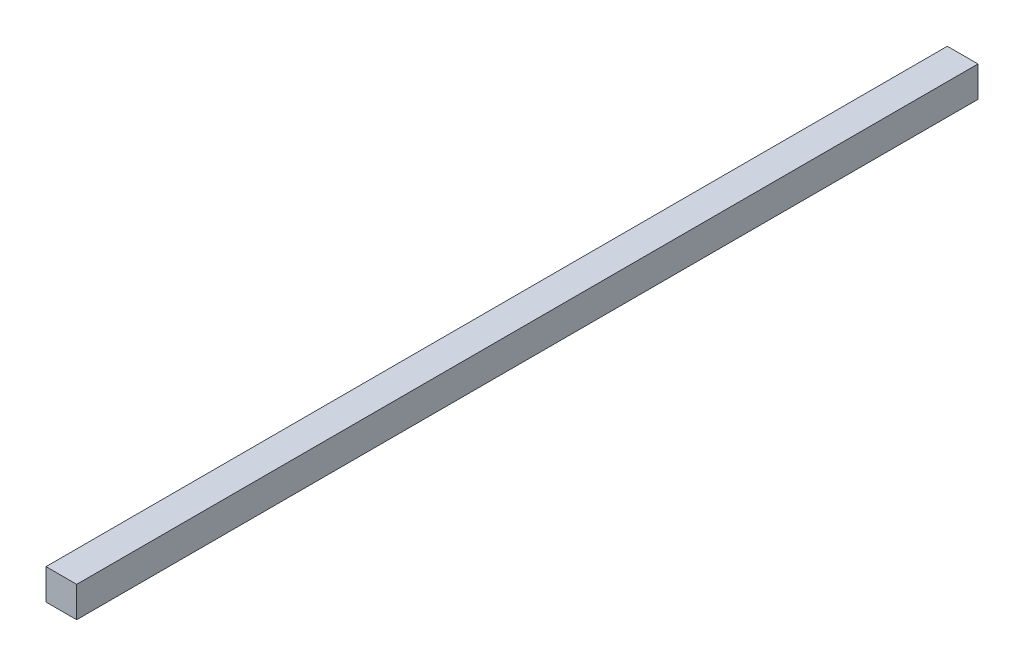
ISO-10303-21;
HEADER;
FILE_DESCRIPTION(('STEP AP214'),'2;1');
FILE_NAME('part.step','',(''),(''),'','','');
FILE_SCHEMA(('AUTOMOTIVE_DESIGN { 1 0 10303 214 1 1 1 1 }'));
ENDSEC;
DATA;
#1=APPLICATION_CONTEXT('core data for automotive mechanical design processes');
#2=APPLICATION_PROTOCOL_DEFINITION('international standard','automotive_design',2000,#1);
#3=PRODUCT_CONTEXT('',#1,'mechanical');
#4=PRODUCT('Part','Part','',(#3));
#5=PRODUCT_RELATED_PRODUCT_CATEGORY('part','',(#4));
#6=PRODUCT_DEFINITION_FORMATION('','',#4);
#7=PRODUCT_DEFINITION_CONTEXT('part definition',#1,'design');
#8=PRODUCT_DEFINITION('design','',#6,#7);
#9=PRODUCT_DEFINITION_SHAPE('','',#8);
#10=(LENGTH_UNIT() NAMED_UNIT(*) SI_UNIT(.MILLI.,.METRE.));
#11=(NAMED_UNIT(*) PLANE_ANGLE_UNIT() SI_UNIT($,.RADIAN.));
#12=(NAMED_UNIT(*) SI_UNIT($,.STERADIAN.) SOLID_ANGLE_UNIT());
#13=UNCERTAINTY_MEASURE_WITH_UNIT(LENGTH_MEASURE(1.E-05),#10,'distance_accuracy_value','');
#14=(GEOMETRIC_REPRESENTATION_CONTEXT(3) GLOBAL_UNCERTAINTY_ASSIGNED_CONTEXT((#13)) GLOBAL_UNIT_ASSIGNED_CONTEXT((#10,
#11,#12)) REPRESENTATION_CONTEXT('',''));
#15=CARTESIAN_POINT('',(0.,0.,0.));
#16=DIRECTION('',(0.,0.,1.));
#17=DIRECTION('',(1.,0.,0.));
#18=AXIS2_PLACEMENT_3D('',#15,#16,#17);
#19=CARTESIAN_POINT('',(1.41224,1.41224,0.));
#20=DIRECTION('',(0.,0.,-1.));
#21=DIRECTION('',(-1.,0.,0.));
#22=AXIS2_PLACEMENT_3D('',#19,#20,#21);
#23=PLANE('',#22);
#24=DIRECTION('',(0.,-1.,0.));
#25=VECTOR('',#24,1.);
#26=CARTESIAN_POINT('',(0.,1.41224,0.));
#27=LINE('',#26,#25);
#28=CARTESIAN_POINT('',(0.,1.41224,0.));
#29=VERTEX_POINT('',#28);
#30=CARTESIAN_POINT('',(0.,0.,0.));
#31=VERTEX_POINT('',#30);
#32=EDGE_CURVE('E96',#29,#31,#27,.T.);
#33=ORIENTED_EDGE('',*,*,#32,.T.);
#34=DIRECTION('',(-1.,0.,0.));
#35=VECTOR('',#34,1.);
#36=CARTESIAN_POINT('',(1.41224,0.,0.));
#37=LINE('',#36,#35);
#38=CARTESIAN_POINT('',(1.41224,0.,0.));
#39=VERTEX_POINT('',#38);
#40=EDGE_CURVE('E11',#39,#31,#37,.T.);
#41=ORIENTED_EDGE('',*,*,#40,.F.);
#42=DIRECTION('',(0.,-1.,0.));
#43=VECTOR('',#42,1.);
#44=CARTESIAN_POINT('',(1.41224,1.41224,0.));
#45=LINE('',#44,#43);
#46=CARTESIAN_POINT('',(1.41224,1.41224,0.));
#47=VERTEX_POINT('',#46);
#48=EDGE_CURVE('E84',#47,#39,#45,.T.);
#49=ORIENTED_EDGE('',*,*,#48,.F.);
#50=DIRECTION('',(-1.,0.,0.));
#51=VECTOR('',#50,1.);
#52=CARTESIAN_POINT('',(1.41224,1.41224,0.));
#53=LINE('',#52,#51);
#54=EDGE_CURVE('E92',#47,#29,#53,.T.);
#55=ORIENTED_EDGE('',*,*,#54,.T.);
#56=EDGE_LOOP('',(#33,#41,#49,#55));
#57=FACE_BOUND('',#56,.T.);
#58=ADVANCED_FACE('F33',(#57),#23,.F.);
#59=CARTESIAN_POINT('',(1.41224,0.,0.));
#60=DIRECTION('',(0.,1.,0.));
#61=DIRECTION('',(0.,0.,1.));
#62=AXIS2_PLACEMENT_3D('',#59,#60,#61);
#63=PLANE('',#62);
#64=DIRECTION('',(0.,0.,-1.));
#65=VECTOR('',#64,1.);
#66=CARTESIAN_POINT('',(0.,0.,0.));
#67=LINE('',#66,#65);
#68=CARTESIAN_POINT('',(0.,0.,-41.4909));
#69=VERTEX_POINT('',#68);
#70=EDGE_CURVE('E88',#31,#69,#67,.T.);
#71=ORIENTED_EDGE('',*,*,#70,.T.);
#72=DIRECTION('',(-1.,0.,0.));
#73=VECTOR('',#72,1.);
#74=CARTESIAN_POINT('',(1.41224,0.,-41.4909));
#75=LINE('',#74,#73);
#76=CARTESIAN_POINT('',(1.41224,0.,-41.4909));
#77=VERTEX_POINT('',#76);
#78=EDGE_CURVE('E41',#77,#69,#75,.T.);
#79=ORIENTED_EDGE('',*,*,#78,.F.);
#80=DIRECTION('',(0.,0.,-1.));
#81=VECTOR('',#80,1.);
#82=CARTESIAN_POINT('',(1.41224,0.,0.));
#83=LINE('',#82,#81);
#84=EDGE_CURVE('E79',#39,#77,#83,.T.);
#85=ORIENTED_EDGE('',*,*,#84,.F.);
#86=ORIENTED_EDGE('',*,*,#40,.T.);
#87=EDGE_LOOP('',(#71,#79,#85,#86));
#88=FACE_BOUND('',#87,.T.);
#89=ADVANCED_FACE('F87',(#88),#63,.F.);
#90=CARTESIAN_POINT('',(1.41224,0.,-41.4909));
#91=DIRECTION('',(0.,0.,1.));
#92=DIRECTION('',(1.,0.,0.));
#93=AXIS2_PLACEMENT_3D('',#90,#91,#92);
#94=PLANE('',#93);
#95=DIRECTION('',(0.,1.,0.));
#96=VECTOR('',#95,1.);
#97=CARTESIAN_POINT('',(0.,0.,-41.4909));
#98=LINE('',#97,#96);
#99=CARTESIAN_POINT('',(0.,1.41224000000001,-41.4909));
#100=VERTEX_POINT('',#99);
#101=EDGE_CURVE('E66',#69,#100,#98,.T.);
#102=ORIENTED_EDGE('',*,*,#101,.T.);
#103=DIRECTION('',(-1.,0.,0.));
#104=VECTOR('',#103,1.);
#105=CARTESIAN_POINT('',(1.41224,1.41224000000001,-41.4909));
#106=LINE('',#105,#104);
#107=CARTESIAN_POINT('',(1.41224,1.41224000000001,-41.4909));
#108=VERTEX_POINT('',#107);
#109=EDGE_CURVE('E89',#108,#100,#106,.T.);
#110=ORIENTED_EDGE('',*,*,#109,.F.);
#111=DIRECTION('',(0.,1.,0.));
#112=VECTOR('',#111,1.);
#113=CARTESIAN_POINT('',(1.41224,0.,-41.4909));
#114=LINE('',#113,#112);
#115=EDGE_CURVE('E82',#77,#108,#114,.T.);
#116=ORIENTED_EDGE('',*,*,#115,.F.);
#117=ORIENTED_EDGE('',*,*,#78,.T.);
#118=EDGE_LOOP('',(#102,#110,#116,#117));
#119=FACE_BOUND('',#118,.T.);
#120=ADVANCED_FACE('F90',(#119),#94,.F.);
#121=CARTESIAN_POINT('',(1.41224,1.41224000000001,-41.4909));
#122=DIRECTION('',(0.,-1.,0.));
#123=DIRECTION('',(0.,0.,-1.));
#124=AXIS2_PLACEMENT_3D('',#121,#122,#123);
#125=PLANE('',#124);
#126=DIRECTION('',(0.,0.,1.));
#127=VECTOR('',#126,1.);
#128=CARTESIAN_POINT('',(0.,1.41224000000001,-41.4909));
#129=LINE('',#128,#127);
#130=EDGE_CURVE('E72',#100,#29,#129,.T.);
#131=ORIENTED_EDGE('',*,*,#130,.T.);
#132=ORIENTED_EDGE('',*,*,#54,.F.);
#133=DIRECTION('',(0.,0.,1.));
#134=VECTOR('',#133,1.);
#135=CARTESIAN_POINT('',(1.41224,1.41224000000001,-41.4909));
#136=LINE('',#135,#134);
#137=EDGE_CURVE('E49',#108,#47,#136,.T.);
#138=ORIENTED_EDGE('',*,*,#137,.F.);
#139=ORIENTED_EDGE('',*,*,#109,.T.);
#140=EDGE_LOOP('',(#131,#132,#138,#139));
#141=FACE_BOUND('',#140,.T.);
#142=ADVANCED_FACE('F103',(#141),#125,.F.);
#143=CARTESIAN_POINT('',(1.41224,0.,0.));
#144=DIRECTION('',(1.,0.,0.));
#145=DIRECTION('',(0.,0.,-1.));
#146=AXIS2_PLACEMENT_3D('',#143,#144,#145);
#147=PLANE('',#146);
#148=ORIENTED_EDGE('',*,*,#48,.T.);
#149=ORIENTED_EDGE('',*,*,#84,.T.);
#150=ORIENTED_EDGE('',*,*,#115,.T.);
#151=ORIENTED_EDGE('',*,*,#137,.T.);
#152=EDGE_LOOP('',(#148,#149,#150,#151));
#153=FACE_BOUND('',#152,.T.);
#154=ADVANCED_FACE('F80',(#153),#147,.T.);
#155=CARTESIAN_POINT('',(0.,0.,0.));
#156=DIRECTION('',(1.,0.,0.));
#157=DIRECTION('',(0.,0.,-1.));
#158=AXIS2_PLACEMENT_3D('',#155,#156,#157);
#159=PLANE('',#158);
#160=ORIENTED_EDGE('',*,*,#32,.F.);
#161=ORIENTED_EDGE('',*,*,#130,.F.);
#162=ORIENTED_EDGE('',*,*,#101,.F.);
#163=ORIENTED_EDGE('',*,*,#70,.F.);
#164=EDGE_LOOP('',(#160,#161,#162,#163));
#165=FACE_BOUND('',#164,.T.);
#166=ADVANCED_FACE('F106',(#165),#159,.F.);
#167=CLOSED_SHELL('',(#58,#89,#120,#142,#154,#166));
#168=MANIFOLD_SOLID_BREP('B2',#167);
#169=ADVANCED_BREP_SHAPE_REPRESENTATION('',(#18,#168),#14);
#170=SHAPE_DEFINITION_REPRESENTATION(#9,#169);
ENDSEC;
END-ISO-10303-21;
